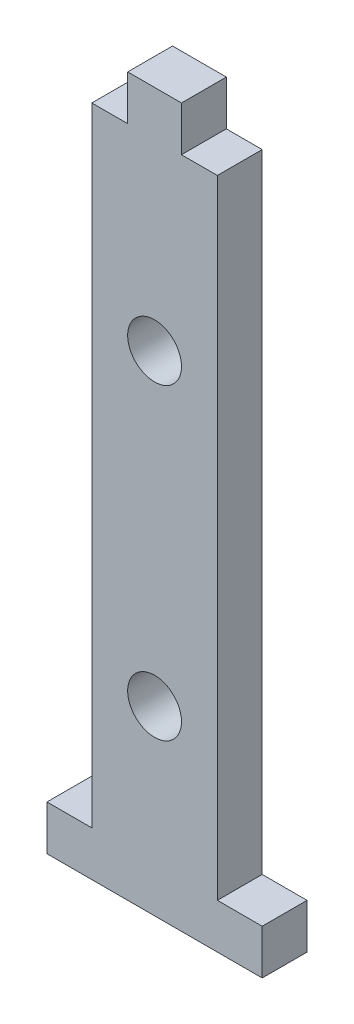
ISO-10303-21;
HEADER;
FILE_DESCRIPTION(('STEP AP214'),'2;1');
FILE_NAME('part.step','',(''),(''),'','','');
FILE_SCHEMA(('AUTOMOTIVE_DESIGN { 1 0 10303 214 1 1 1 1 }'));
ENDSEC;
DATA;
#1=APPLICATION_CONTEXT('core data for automotive mechanical design processes');
#2=APPLICATION_PROTOCOL_DEFINITION('international standard','automotive_design',2000,#1);
#3=PRODUCT_CONTEXT('',#1,'mechanical');
#4=PRODUCT('Part','Part','',(#3));
#5=PRODUCT_RELATED_PRODUCT_CATEGORY('part','',(#4));
#6=PRODUCT_DEFINITION_FORMATION('','',#4);
#7=PRODUCT_DEFINITION_CONTEXT('part definition',#1,'design');
#8=PRODUCT_DEFINITION('design','',#6,#7);
#9=PRODUCT_DEFINITION_SHAPE('','',#8);
#10=(LENGTH_UNIT() NAMED_UNIT(*) SI_UNIT(.MILLI.,.METRE.));
#11=(NAMED_UNIT(*) PLANE_ANGLE_UNIT() SI_UNIT($,.RADIAN.));
#12=(NAMED_UNIT(*) SI_UNIT($,.STERADIAN.) SOLID_ANGLE_UNIT());
#13=UNCERTAINTY_MEASURE_WITH_UNIT(LENGTH_MEASURE(1.E-05),#10,'distance_accuracy_value','');
#14=(GEOMETRIC_REPRESENTATION_CONTEXT(3) GLOBAL_UNCERTAINTY_ASSIGNED_CONTEXT((#13)) GLOBAL_UNIT_ASSIGNED_CONTEXT((#10,
#11,#12)) REPRESENTATION_CONTEXT('',''));
#15=CARTESIAN_POINT('',(0.,0.,0.));
#16=DIRECTION('',(0.,0.,1.));
#17=DIRECTION('',(1.,0.,0.));
#18=AXIS2_PLACEMENT_3D('',#15,#16,#17);
#19=CARTESIAN_POINT('',(0.,0.,2.5));
#20=DIRECTION('',(0.,0.,-1.));
#21=DIRECTION('',(-1.,0.,0.));
#22=AXIS2_PLACEMENT_3D('',#19,#20,#21);
#23=PLANE('',#22);
#24=DIRECTION('',(1.,0.,0.));
#25=VECTOR('',#24,1.);
#26=CARTESIAN_POINT('',(-6.,-20.,2.5));
#27=LINE('',#26,#25);
#28=CARTESIAN_POINT('',(-6.,-20.,2.5));
#29=VERTEX_POINT('',#28);
#30=CARTESIAN_POINT('',(6.,-20.,2.5));
#31=VERTEX_POINT('',#30);
#32=EDGE_CURVE('E177',#29,#31,#27,.T.);
#33=ORIENTED_EDGE('',*,*,#32,.T.);
#34=DIRECTION('',(0.,1.,0.));
#35=VECTOR('',#34,1.);
#36=CARTESIAN_POINT('',(6.,-17.5,2.5));
#37=LINE('',#36,#35);
#38=CARTESIAN_POINT('',(6.,-17.5,2.5));
#39=VERTEX_POINT('',#38);
#40=EDGE_CURVE('E105',#31,#39,#37,.T.);
#41=ORIENTED_EDGE('',*,*,#40,.T.);
#42=DIRECTION('',(-1.,0.,0.));
#43=VECTOR('',#42,1.);
#44=CARTESIAN_POINT('',(3.5,-17.5,2.5));
#45=LINE('',#44,#43);
#46=CARTESIAN_POINT('',(3.5,-17.5,2.5));
#47=VERTEX_POINT('',#46);
#48=EDGE_CURVE('E204',#39,#47,#45,.T.);
#49=ORIENTED_EDGE('',*,*,#48,.T.);
#50=DIRECTION('',(0.,1.,0.));
#51=VECTOR('',#50,1.);
#52=CARTESIAN_POINT('',(3.5,17.5,2.5));
#53=LINE('',#52,#51);
#54=CARTESIAN_POINT('',(3.5,17.5,2.5));
#55=VERTEX_POINT('',#54);
#56=EDGE_CURVE('E223',#47,#55,#53,.T.);
#57=ORIENTED_EDGE('',*,*,#56,.T.);
#58=DIRECTION('',(-1.,0.,0.));
#59=VECTOR('',#58,1.);
#60=CARTESIAN_POINT('',(1.5,17.5,2.5));
#61=LINE('',#60,#59);
#62=CARTESIAN_POINT('',(1.5,17.5,2.5));
#63=VERTEX_POINT('',#62);
#64=EDGE_CURVE('E220',#55,#63,#61,.T.);
#65=ORIENTED_EDGE('',*,*,#64,.T.);
#66=DIRECTION('',(0.,1.,0.));
#67=VECTOR('',#66,1.);
#68=CARTESIAN_POINT('',(1.5,20.,2.5));
#69=LINE('',#68,#67);
#70=CARTESIAN_POINT('',(1.5,20.,2.5));
#71=VERTEX_POINT('',#70);
#72=EDGE_CURVE('E222',#63,#71,#69,.T.);
#73=ORIENTED_EDGE('',*,*,#72,.T.);
#74=DIRECTION('',(-1.,0.,0.));
#75=VECTOR('',#74,1.);
#76=CARTESIAN_POINT('',(1.5,20.,2.5));
#77=LINE('',#76,#75);
#78=CARTESIAN_POINT('',(-1.5,20.,2.5));
#79=VERTEX_POINT('',#78);
#80=EDGE_CURVE('E225',#71,#79,#77,.T.);
#81=ORIENTED_EDGE('',*,*,#80,.T.);
#82=DIRECTION('',(0.,-1.,0.));
#83=VECTOR('',#82,1.);
#84=CARTESIAN_POINT('',(-1.5,20.,2.5));
#85=LINE('',#84,#83);
#86=CARTESIAN_POINT('',(-1.5,17.5,2.5));
#87=VERTEX_POINT('',#86);
#88=EDGE_CURVE('E231',#79,#87,#85,.T.);
#89=ORIENTED_EDGE('',*,*,#88,.T.);
#90=DIRECTION('',(-1.,0.,0.));
#91=VECTOR('',#90,1.);
#92=CARTESIAN_POINT('',(-1.5,17.5,2.5));
#93=LINE('',#92,#91);
#94=CARTESIAN_POINT('',(-3.5,17.5,2.5));
#95=VERTEX_POINT('',#94);
#96=EDGE_CURVE('E136',#87,#95,#93,.T.);
#97=ORIENTED_EDGE('',*,*,#96,.T.);
#98=DIRECTION('',(0.,-1.,0.));
#99=VECTOR('',#98,1.);
#100=CARTESIAN_POINT('',(-3.5,17.5,2.5));
#101=LINE('',#100,#99);
#102=CARTESIAN_POINT('',(-3.5,-17.5,2.5));
#103=VERTEX_POINT('',#102);
#104=EDGE_CURVE('E130',#95,#103,#101,.T.);
#105=ORIENTED_EDGE('',*,*,#104,.T.);
#106=DIRECTION('',(-1.,0.,0.));
#107=VECTOR('',#106,1.);
#108=CARTESIAN_POINT('',(-3.5,-17.5,2.5));
#109=LINE('',#108,#107);
#110=CARTESIAN_POINT('',(-5.99999999999999,-17.5,2.5));
#111=VERTEX_POINT('',#110);
#112=EDGE_CURVE('E134',#103,#111,#109,.T.);
#113=ORIENTED_EDGE('',*,*,#112,.T.);
#114=DIRECTION('',(0.,-1.,0.));
#115=VECTOR('',#114,1.);
#116=CARTESIAN_POINT('',(-5.99999999999999,-17.5,2.5));
#117=LINE('',#116,#115);
#118=EDGE_CURVE('E50',#111,#29,#117,.T.);
#119=ORIENTED_EDGE('',*,*,#118,.T.);
#120=EDGE_LOOP('',(#33,#41,#49,#57,#65,#73,#81,#89,#97,#105,#113,#119));
#121=FACE_BOUND('',#120,.T.);
#122=CARTESIAN_POINT('',(0.,-9.88,2.5));
#123=DIRECTION('',(0.,0.,1.));
#124=DIRECTION('',(1.,0.,0.));
#125=AXIS2_PLACEMENT_3D('',#122,#123,#124);
#126=CIRCLE('',#125,1.5);
#127=CARTESIAN_POINT('',(1.5,-9.88,2.5));
#128=VERTEX_POINT('',#127);
#129=EDGE_CURVE('E158',#128,#128,#126,.T.);
#130=ORIENTED_EDGE('',*,*,#129,.F.);
#131=EDGE_LOOP('',(#130));
#132=FACE_BOUND('',#131,.T.);
#133=CARTESIAN_POINT('',(0.,7.28,2.5));
#134=DIRECTION('',(0.,0.,1.));
#135=DIRECTION('',(1.,0.,0.));
#136=AXIS2_PLACEMENT_3D('',#133,#134,#135);
#137=CIRCLE('',#136,1.5);
#138=CARTESIAN_POINT('',(1.5,7.28,2.5));
#139=VERTEX_POINT('',#138);
#140=EDGE_CURVE('E272',#139,#139,#137,.T.);
#141=ORIENTED_EDGE('',*,*,#140,.F.);
#142=EDGE_LOOP('',(#141));
#143=FACE_BOUND('',#142,.T.);
#144=ADVANCED_FACE('F33',(#121,#132,#143),#23,.F.);
#145=CARTESIAN_POINT('',(0.,0.,0.));
#146=DIRECTION('',(0.,0.,-1.));
#147=DIRECTION('',(-1.,0.,0.));
#148=AXIS2_PLACEMENT_3D('',#145,#146,#147);
#149=PLANE('',#148);
#150=CARTESIAN_POINT('',(0.,-9.88,0.));
#151=DIRECTION('',(0.,0.,1.));
#152=DIRECTION('',(1.,0.,0.));
#153=AXIS2_PLACEMENT_3D('',#150,#151,#152);
#154=CIRCLE('',#153,1.5);
#155=CARTESIAN_POINT('',(1.5,-9.88,0.));
#156=VERTEX_POINT('',#155);
#157=EDGE_CURVE('E277',#156,#156,#154,.T.);
#158=ORIENTED_EDGE('',*,*,#157,.T.);
#159=EDGE_LOOP('',(#158));
#160=FACE_BOUND('',#159,.T.);
#161=DIRECTION('',(1.,0.,0.));
#162=VECTOR('',#161,1.);
#163=CARTESIAN_POINT('',(-6.,-20.,0.));
#164=LINE('',#163,#162);
#165=CARTESIAN_POINT('',(-6.,-20.,0.));
#166=VERTEX_POINT('',#165);
#167=CARTESIAN_POINT('',(6.,-20.,0.));
#168=VERTEX_POINT('',#167);
#169=EDGE_CURVE('E154',#166,#168,#164,.T.);
#170=ORIENTED_EDGE('',*,*,#169,.F.);
#171=DIRECTION('',(0.,-1.,0.));
#172=VECTOR('',#171,1.);
#173=CARTESIAN_POINT('',(-5.99999999999999,-17.5,0.));
#174=LINE('',#173,#172);
#175=CARTESIAN_POINT('',(-5.99999999999999,-17.5,0.));
#176=VERTEX_POINT('',#175);
#177=EDGE_CURVE('E97',#176,#166,#174,.T.);
#178=ORIENTED_EDGE('',*,*,#177,.F.);
#179=DIRECTION('',(-1.,0.,0.));
#180=VECTOR('',#179,1.);
#181=CARTESIAN_POINT('',(-3.5,-17.5,0.));
#182=LINE('',#181,#180);
#183=CARTESIAN_POINT('',(-3.5,-17.5,0.));
#184=VERTEX_POINT('',#183);
#185=EDGE_CURVE('E91',#184,#176,#182,.T.);
#186=ORIENTED_EDGE('',*,*,#185,.F.);
#187=DIRECTION('',(0.,-1.,0.));
#188=VECTOR('',#187,1.);
#189=CARTESIAN_POINT('',(-3.5,17.5,0.));
#190=LINE('',#189,#188);
#191=CARTESIAN_POINT('',(-3.5,17.5,0.));
#192=VERTEX_POINT('',#191);
#193=EDGE_CURVE('E144',#192,#184,#190,.T.);
#194=ORIENTED_EDGE('',*,*,#193,.F.);
#195=DIRECTION('',(-1.,0.,0.));
#196=VECTOR('',#195,1.);
#197=CARTESIAN_POINT('',(-1.5,17.5,0.));
#198=LINE('',#197,#196);
#199=CARTESIAN_POINT('',(-1.5,17.5,0.));
#200=VERTEX_POINT('',#199);
#201=EDGE_CURVE('E172',#200,#192,#198,.T.);
#202=ORIENTED_EDGE('',*,*,#201,.F.);
#203=DIRECTION('',(0.,-1.,0.));
#204=VECTOR('',#203,1.);
#205=CARTESIAN_POINT('',(-1.5,20.,0.));
#206=LINE('',#205,#204);
#207=CARTESIAN_POINT('',(-1.5,20.,0.));
#208=VERTEX_POINT('',#207);
#209=EDGE_CURVE('E170',#208,#200,#206,.T.);
#210=ORIENTED_EDGE('',*,*,#209,.F.);
#211=DIRECTION('',(-1.,0.,0.));
#212=VECTOR('',#211,1.);
#213=CARTESIAN_POINT('',(1.5,20.,0.));
#214=LINE('',#213,#212);
#215=CARTESIAN_POINT('',(1.5,20.,0.));
#216=VERTEX_POINT('',#215);
#217=EDGE_CURVE('E168',#216,#208,#214,.T.);
#218=ORIENTED_EDGE('',*,*,#217,.F.);
#219=DIRECTION('',(0.,1.,0.));
#220=VECTOR('',#219,1.);
#221=CARTESIAN_POINT('',(1.5,20.,0.));
#222=LINE('',#221,#220);
#223=CARTESIAN_POINT('',(1.5,17.5,0.));
#224=VERTEX_POINT('',#223);
#225=EDGE_CURVE('E166',#224,#216,#222,.T.);
#226=ORIENTED_EDGE('',*,*,#225,.F.);
#227=DIRECTION('',(-1.,0.,0.));
#228=VECTOR('',#227,1.);
#229=CARTESIAN_POINT('',(1.5,17.5,0.));
#230=LINE('',#229,#228);
#231=CARTESIAN_POINT('',(3.5,17.5,0.));
#232=VERTEX_POINT('',#231);
#233=EDGE_CURVE('E164',#232,#224,#230,.T.);
#234=ORIENTED_EDGE('',*,*,#233,.F.);
#235=DIRECTION('',(0.,1.,0.));
#236=VECTOR('',#235,1.);
#237=CARTESIAN_POINT('',(3.5,17.5,0.));
#238=LINE('',#237,#236);
#239=CARTESIAN_POINT('',(3.5,-17.5,0.));
#240=VERTEX_POINT('',#239);
#241=EDGE_CURVE('E162',#240,#232,#238,.T.);
#242=ORIENTED_EDGE('',*,*,#241,.F.);
#243=DIRECTION('',(-1.,0.,0.));
#244=VECTOR('',#243,1.);
#245=CARTESIAN_POINT('',(3.5,-17.5,0.));
#246=LINE('',#245,#244);
#247=CARTESIAN_POINT('',(6.,-17.5,0.));
#248=VERTEX_POINT('',#247);
#249=EDGE_CURVE('E160',#248,#240,#246,.T.);
#250=ORIENTED_EDGE('',*,*,#249,.F.);
#251=DIRECTION('',(0.,1.,0.));
#252=VECTOR('',#251,1.);
#253=CARTESIAN_POINT('',(6.,-17.5,0.));
#254=LINE('',#253,#252);
#255=EDGE_CURVE('E157',#168,#248,#254,.T.);
#256=ORIENTED_EDGE('',*,*,#255,.F.);
#257=EDGE_LOOP('',(#170,#178,#186,#194,#202,#210,#218,#226,#234,#242,#250,#256));
#258=FACE_BOUND('',#257,.T.);
#259=CARTESIAN_POINT('',(0.,7.28,0.));
#260=DIRECTION('',(0.,0.,1.));
#261=DIRECTION('',(1.,0.,0.));
#262=AXIS2_PLACEMENT_3D('',#259,#260,#261);
#263=CIRCLE('',#262,1.5);
#264=CARTESIAN_POINT('',(1.5,7.28,0.));
#265=VERTEX_POINT('',#264);
#266=EDGE_CURVE('E275',#265,#265,#263,.T.);
#267=ORIENTED_EDGE('',*,*,#266,.T.);
#268=EDGE_LOOP('',(#267));
#269=FACE_BOUND('',#268,.T.);
#270=ADVANCED_FACE('F208',(#160,#258,#269),#149,.T.);
#271=CARTESIAN_POINT('',(-6.,-20.,2.5));
#272=DIRECTION('',(0.,1.,0.));
#273=DIRECTION('',(0.,0.,1.));
#274=AXIS2_PLACEMENT_3D('',#271,#272,#273);
#275=PLANE('',#274);
#276=ORIENTED_EDGE('',*,*,#169,.T.);
#277=DIRECTION('',(0.,0.,-1.));
#278=VECTOR('',#277,1.);
#279=CARTESIAN_POINT('',(6.,-20.,2.5));
#280=LINE('',#279,#278);
#281=EDGE_CURVE('E11',#31,#168,#280,.T.);
#282=ORIENTED_EDGE('',*,*,#281,.F.);
#283=ORIENTED_EDGE('',*,*,#32,.F.);
#284=DIRECTION('',(0.,0.,-1.));
#285=VECTOR('',#284,1.);
#286=CARTESIAN_POINT('',(-6.,-20.,2.5));
#287=LINE('',#286,#285);
#288=EDGE_CURVE('E150',#29,#166,#287,.T.);
#289=ORIENTED_EDGE('',*,*,#288,.T.);
#290=EDGE_LOOP('',(#276,#282,#283,#289));
#291=FACE_BOUND('',#290,.T.);
#292=ADVANCED_FACE('F35',(#291),#275,.F.);
#293=CARTESIAN_POINT('',(6.,-17.5,2.5));
#294=DIRECTION('',(-1.,0.,0.));
#295=DIRECTION('',(0.,-1.,0.));
#296=AXIS2_PLACEMENT_3D('',#293,#294,#295);
#297=PLANE('',#296);
#298=ORIENTED_EDGE('',*,*,#255,.T.);
#299=DIRECTION('',(0.,0.,-1.));
#300=VECTOR('',#299,1.);
#301=CARTESIAN_POINT('',(6.,-17.5,2.5));
#302=LINE('',#301,#300);
#303=EDGE_CURVE('E42',#39,#248,#302,.T.);
#304=ORIENTED_EDGE('',*,*,#303,.F.);
#305=ORIENTED_EDGE('',*,*,#40,.F.);
#306=ORIENTED_EDGE('',*,*,#281,.T.);
#307=EDGE_LOOP('',(#298,#304,#305,#306));
#308=FACE_BOUND('',#307,.T.);
#309=ADVANCED_FACE('F372',(#308),#297,.F.);
#310=CARTESIAN_POINT('',(3.5,-17.5,2.5));
#311=DIRECTION('',(0.,-1.,0.));
#312=DIRECTION('',(0.,0.,-1.));
#313=AXIS2_PLACEMENT_3D('',#310,#311,#312);
#314=PLANE('',#313);
#315=ORIENTED_EDGE('',*,*,#249,.T.);
#316=DIRECTION('',(0.,0.,-1.));
#317=VECTOR('',#316,1.);
#318=CARTESIAN_POINT('',(3.5,-17.5,2.5));
#319=LINE('',#318,#317);
#320=EDGE_CURVE('E196',#47,#240,#319,.T.);
#321=ORIENTED_EDGE('',*,*,#320,.F.);
#322=ORIENTED_EDGE('',*,*,#48,.F.);
#323=ORIENTED_EDGE('',*,*,#303,.T.);
#324=EDGE_LOOP('',(#315,#321,#322,#323));
#325=FACE_BOUND('',#324,.T.);
#326=ADVANCED_FACE('F202',(#325),#314,.F.);
#327=CARTESIAN_POINT('',(3.5,17.5,2.5));
#328=DIRECTION('',(-1.,0.,0.));
#329=DIRECTION('',(0.,-1.,0.));
#330=AXIS2_PLACEMENT_3D('',#327,#328,#329);
#331=PLANE('',#330);
#332=ORIENTED_EDGE('',*,*,#241,.T.);
#333=DIRECTION('',(0.,0.,-1.));
#334=VECTOR('',#333,1.);
#335=CARTESIAN_POINT('',(3.5,17.5,2.5));
#336=LINE('',#335,#334);
#337=EDGE_CURVE('E193',#55,#232,#336,.T.);
#338=ORIENTED_EDGE('',*,*,#337,.F.);
#339=ORIENTED_EDGE('',*,*,#56,.F.);
#340=ORIENTED_EDGE('',*,*,#320,.T.);
#341=EDGE_LOOP('',(#332,#338,#339,#340));
#342=FACE_BOUND('',#341,.T.);
#343=ADVANCED_FACE('F214',(#342),#331,.F.);
#344=CARTESIAN_POINT('',(1.5,17.5,2.5));
#345=DIRECTION('',(0.,-1.,0.));
#346=DIRECTION('',(0.,0.,-1.));
#347=AXIS2_PLACEMENT_3D('',#344,#345,#346);
#348=PLANE('',#347);
#349=ORIENTED_EDGE('',*,*,#233,.T.);
#350=DIRECTION('',(0.,0.,-1.));
#351=VECTOR('',#350,1.);
#352=CARTESIAN_POINT('',(1.5,17.5,2.5));
#353=LINE('',#352,#351);
#354=EDGE_CURVE('E190',#63,#224,#353,.T.);
#355=ORIENTED_EDGE('',*,*,#354,.F.);
#356=ORIENTED_EDGE('',*,*,#64,.F.);
#357=ORIENTED_EDGE('',*,*,#337,.T.);
#358=EDGE_LOOP('',(#349,#355,#356,#357));
#359=FACE_BOUND('',#358,.T.);
#360=ADVANCED_FACE('F218',(#359),#348,.F.);
#361=CARTESIAN_POINT('',(1.5,20.,2.5));
#362=DIRECTION('',(-1.,0.,0.));
#363=DIRECTION('',(0.,-1.,0.));
#364=AXIS2_PLACEMENT_3D('',#361,#362,#363);
#365=PLANE('',#364);
#366=ORIENTED_EDGE('',*,*,#225,.T.);
#367=DIRECTION('',(0.,0.,-1.));
#368=VECTOR('',#367,1.);
#369=CARTESIAN_POINT('',(1.5,20.,2.5));
#370=LINE('',#369,#368);
#371=EDGE_CURVE('E187',#71,#216,#370,.T.);
#372=ORIENTED_EDGE('',*,*,#371,.F.);
#373=ORIENTED_EDGE('',*,*,#72,.F.);
#374=ORIENTED_EDGE('',*,*,#354,.T.);
#375=EDGE_LOOP('',(#366,#372,#373,#374));
#376=FACE_BOUND('',#375,.T.);
#377=ADVANCED_FACE('F337',(#376),#365,.F.);
#378=CARTESIAN_POINT('',(1.5,20.,2.5));
#379=DIRECTION('',(0.,-1.,0.));
#380=DIRECTION('',(0.,0.,-1.));
#381=AXIS2_PLACEMENT_3D('',#378,#379,#380);
#382=PLANE('',#381);
#383=ORIENTED_EDGE('',*,*,#217,.T.);
#384=DIRECTION('',(0.,0.,-1.));
#385=VECTOR('',#384,1.);
#386=CARTESIAN_POINT('',(-1.5,20.,2.5));
#387=LINE('',#386,#385);
#388=EDGE_CURVE('E184',#79,#208,#387,.T.);
#389=ORIENTED_EDGE('',*,*,#388,.F.);
#390=ORIENTED_EDGE('',*,*,#80,.F.);
#391=ORIENTED_EDGE('',*,*,#371,.T.);
#392=EDGE_LOOP('',(#383,#389,#390,#391));
#393=FACE_BOUND('',#392,.T.);
#394=ADVANCED_FACE('F328',(#393),#382,.F.);
#395=CARTESIAN_POINT('',(-1.5,20.,2.5));
#396=DIRECTION('',(1.,0.,0.));
#397=DIRECTION('',(0.,1.,0.));
#398=AXIS2_PLACEMENT_3D('',#395,#396,#397);
#399=PLANE('',#398);
#400=ORIENTED_EDGE('',*,*,#209,.T.);
#401=DIRECTION('',(0.,0.,-1.));
#402=VECTOR('',#401,1.);
#403=CARTESIAN_POINT('',(-1.5,17.5,2.5));
#404=LINE('',#403,#402);
#405=EDGE_CURVE('E181',#87,#200,#404,.T.);
#406=ORIENTED_EDGE('',*,*,#405,.F.);
#407=ORIENTED_EDGE('',*,*,#88,.F.);
#408=ORIENTED_EDGE('',*,*,#388,.T.);
#409=EDGE_LOOP('',(#400,#406,#407,#408));
#410=FACE_BOUND('',#409,.T.);
#411=ADVANCED_FACE('F237',(#410),#399,.F.);
#412=CARTESIAN_POINT('',(-1.5,17.5,2.5));
#413=DIRECTION('',(0.,-1.,0.));
#414=DIRECTION('',(0.,0.,-1.));
#415=AXIS2_PLACEMENT_3D('',#412,#413,#414);
#416=PLANE('',#415);
#417=ORIENTED_EDGE('',*,*,#201,.T.);
#418=DIRECTION('',(0.,0.,-1.));
#419=VECTOR('',#418,1.);
#420=CARTESIAN_POINT('',(-3.5,17.5,2.5));
#421=LINE('',#420,#419);
#422=EDGE_CURVE('E145',#95,#192,#421,.T.);
#423=ORIENTED_EDGE('',*,*,#422,.F.);
#424=ORIENTED_EDGE('',*,*,#96,.F.);
#425=ORIENTED_EDGE('',*,*,#405,.T.);
#426=EDGE_LOOP('',(#417,#423,#424,#425));
#427=FACE_BOUND('',#426,.T.);
#428=ADVANCED_FACE('F241',(#427),#416,.F.);
#429=CARTESIAN_POINT('',(-3.5,17.5,2.5));
#430=DIRECTION('',(1.,0.,0.));
#431=DIRECTION('',(0.,1.,0.));
#432=AXIS2_PLACEMENT_3D('',#429,#430,#431);
#433=PLANE('',#432);
#434=ORIENTED_EDGE('',*,*,#193,.T.);
#435=DIRECTION('',(0.,0.,-1.));
#436=VECTOR('',#435,1.);
#437=CARTESIAN_POINT('',(-3.5,-17.5,2.5));
#438=LINE('',#437,#436);
#439=EDGE_CURVE('E141',#103,#184,#438,.T.);
#440=ORIENTED_EDGE('',*,*,#439,.F.);
#441=ORIENTED_EDGE('',*,*,#104,.F.);
#442=ORIENTED_EDGE('',*,*,#422,.T.);
#443=EDGE_LOOP('',(#434,#440,#441,#442));
#444=FACE_BOUND('',#443,.T.);
#445=ADVANCED_FACE('F142',(#444),#433,.F.);
#446=CARTESIAN_POINT('',(-3.5,-17.5,2.5));
#447=DIRECTION('',(0.,-1.,0.));
#448=DIRECTION('',(0.,0.,-1.));
#449=AXIS2_PLACEMENT_3D('',#446,#447,#448);
#450=PLANE('',#449);
#451=ORIENTED_EDGE('',*,*,#185,.T.);
#452=DIRECTION('',(0.,0.,-1.));
#453=VECTOR('',#452,1.);
#454=CARTESIAN_POINT('',(-5.99999999999999,-17.5,2.5));
#455=LINE('',#454,#453);
#456=EDGE_CURVE('E146',#111,#176,#455,.T.);
#457=ORIENTED_EDGE('',*,*,#456,.F.);
#458=ORIENTED_EDGE('',*,*,#112,.F.);
#459=ORIENTED_EDGE('',*,*,#439,.T.);
#460=EDGE_LOOP('',(#451,#457,#458,#459));
#461=FACE_BOUND('',#460,.T.);
#462=ADVANCED_FACE('F148',(#461),#450,.F.);
#463=CARTESIAN_POINT('',(-5.99999999999999,-17.5,2.5));
#464=DIRECTION('',(1.,0.,0.));
#465=DIRECTION('',(0.,1.,0.));
#466=AXIS2_PLACEMENT_3D('',#463,#464,#465);
#467=PLANE('',#466);
#468=ORIENTED_EDGE('',*,*,#177,.T.);
#469=ORIENTED_EDGE('',*,*,#288,.F.);
#470=ORIENTED_EDGE('',*,*,#118,.F.);
#471=ORIENTED_EDGE('',*,*,#456,.T.);
#472=EDGE_LOOP('',(#468,#469,#470,#471));
#473=FACE_BOUND('',#472,.T.);
#474=ADVANCED_FACE('F245',(#473),#467,.F.);
#475=CARTESIAN_POINT('',(0.,-9.88,2.5));
#476=DIRECTION('',(0.,0.,-1.));
#477=DIRECTION('',(-1.,0.,0.));
#478=AXIS2_PLACEMENT_3D('',#475,#476,#477);
#479=CYLINDRICAL_SURFACE('',#478,1.5);
#480=ORIENTED_EDGE('',*,*,#129,.T.);
#481=EDGE_LOOP('',(#480));
#482=FACE_BOUND('',#481,.T.);
#483=ORIENTED_EDGE('',*,*,#157,.F.);
#484=EDGE_LOOP('',(#483));
#485=FACE_BOUND('',#484,.T.);
#486=ADVANCED_FACE('F247',(#482,#485),#479,.F.);
#487=CARTESIAN_POINT('',(0.,7.28,2.5));
#488=DIRECTION('',(0.,0.,-1.));
#489=DIRECTION('',(-1.,0.,0.));
#490=AXIS2_PLACEMENT_3D('',#487,#488,#489);
#491=CYLINDRICAL_SURFACE('',#490,1.5);
#492=ORIENTED_EDGE('',*,*,#140,.T.);
#493=EDGE_LOOP('',(#492));
#494=FACE_BOUND('',#493,.T.);
#495=ORIENTED_EDGE('',*,*,#266,.F.);
#496=EDGE_LOOP('',(#495));
#497=FACE_BOUND('',#496,.T.);
#498=ADVANCED_FACE('F253',(#494,#497),#491,.F.);
#499=CLOSED_SHELL('',(#144,#270,#292,#309,#326,#343,#360,#377,#394,#411,#428,#445,#462,#474,
#486,#498));
#500=MANIFOLD_SOLID_BREP('B2',#499);
#501=ADVANCED_BREP_SHAPE_REPRESENTATION('',(#18,#500),#14);
#502=SHAPE_DEFINITION_REPRESENTATION(#9,#501);
ENDSEC;
END-ISO-10303-21;
